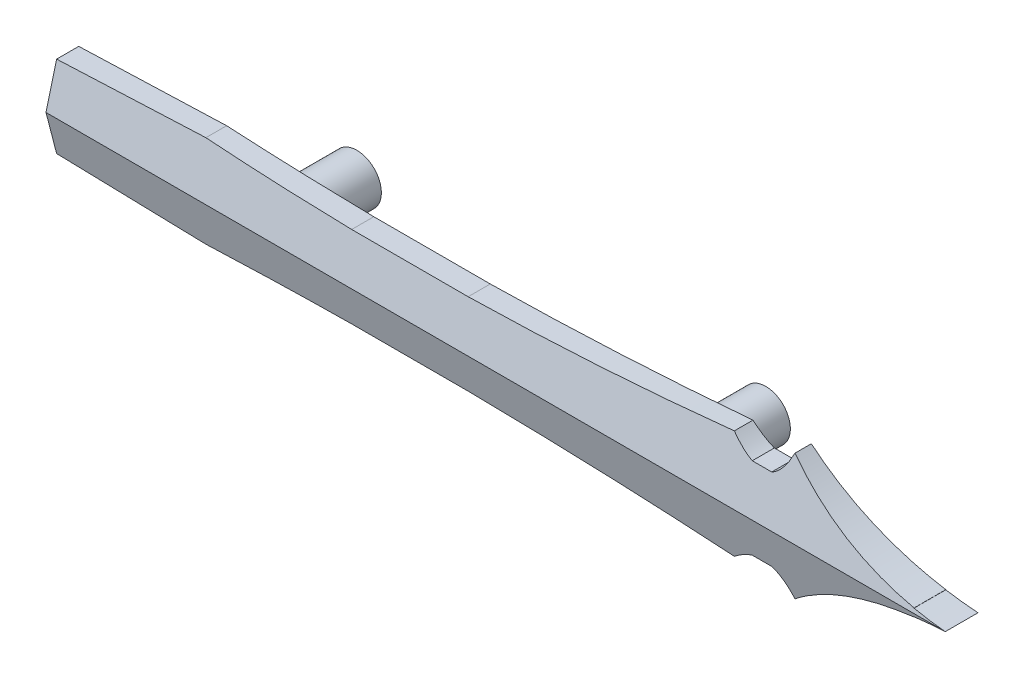
ISO-10303-21;
HEADER;
FILE_DESCRIPTION(('STEP AP214'),'2;1');
FILE_NAME('part.step','',(''),(''),'','','');
FILE_SCHEMA(('AUTOMOTIVE_DESIGN { 1 0 10303 214 1 1 1 1 }'));
ENDSEC;
DATA;
#1=APPLICATION_CONTEXT('core data for automotive mechanical design processes');
#2=APPLICATION_PROTOCOL_DEFINITION('international standard','automotive_design',2000,#1);
#3=PRODUCT_CONTEXT('',#1,'mechanical');
#4=PRODUCT('Part','Part','',(#3));
#5=PRODUCT_RELATED_PRODUCT_CATEGORY('part','',(#4));
#6=PRODUCT_DEFINITION_FORMATION('','',#4);
#7=PRODUCT_DEFINITION_CONTEXT('part definition',#1,'design');
#8=PRODUCT_DEFINITION('design','',#6,#7);
#9=PRODUCT_DEFINITION_SHAPE('','',#8);
#10=(LENGTH_UNIT() NAMED_UNIT(*) SI_UNIT(.MILLI.,.METRE.));
#11=(NAMED_UNIT(*) PLANE_ANGLE_UNIT() SI_UNIT($,.RADIAN.));
#12=(NAMED_UNIT(*) SI_UNIT($,.STERADIAN.) SOLID_ANGLE_UNIT());
#13=UNCERTAINTY_MEASURE_WITH_UNIT(LENGTH_MEASURE(1.E-05),#10,'distance_accuracy_value','');
#14=(GEOMETRIC_REPRESENTATION_CONTEXT(3) GLOBAL_UNCERTAINTY_ASSIGNED_CONTEXT((#13)) GLOBAL_UNIT_ASSIGNED_CONTEXT((#10,
#11,#12)) REPRESENTATION_CONTEXT('',''));
#15=CARTESIAN_POINT('',(0.,0.,0.));
#16=DIRECTION('',(0.,0.,1.));
#17=DIRECTION('',(1.,0.,0.));
#18=AXIS2_PLACEMENT_3D('',#15,#16,#17);
#19=CARTESIAN_POINT('',(0.,0.,2.));
#20=DIRECTION('',(0.,1.,0.));
#21=DIRECTION('',(0.,0.,1.));
#22=AXIS2_PLACEMENT_3D('',#19,#20,#21);
#23=PLANE('',#22);
#24=DIRECTION('',(0.,0.,1.));
#25=VECTOR('',#24,1.);
#26=CARTESIAN_POINT('',(43.7125403808732,0.,0.));
#27=LINE('',#26,#25);
#28=CARTESIAN_POINT('',(43.7125403813381,-2.16670404491401E-10,0.));
#29=VERTEX_POINT('',#28);
#30=CARTESIAN_POINT('',(43.712540373723,3.33268501228993E-09,1.35167559611729));
#31=VERTEX_POINT('',#30);
#32=EDGE_CURVE('E417',#29,#31,#27,.T.);
#33=ORIENTED_EDGE('',*,*,#32,.T.);
#34=DIRECTION('',(-1.,0.,0.));
#35=VECTOR('',#34,1.);
#36=CARTESIAN_POINT('',(0.,0.,1.35167559525303));
#37=LINE('',#36,#35);
#38=CARTESIAN_POINT('',(42.5233075347022,0.,1.35167559525303));
#39=VERTEX_POINT('',#38);
#40=EDGE_CURVE('E513',#31,#39,#37,.T.);
#41=ORIENTED_EDGE('',*,*,#40,.T.);
#42=DIRECTION('',(0.,0.,1.));
#43=VECTOR('',#42,1.);
#44=CARTESIAN_POINT('',(42.5233075339642,1.46421503394167E-13,0.));
#45=LINE('',#44,#43);
#46=CARTESIAN_POINT('',(42.5233075347022,2.68764421525527E-10,0.));
#47=VERTEX_POINT('',#46);
#48=EDGE_CURVE('E425',#39,#47,#45,.F.);
#49=ORIENTED_EDGE('',*,*,#48,.T.);
#50=DIRECTION('',(1.,0.,0.));
#51=VECTOR('',#50,1.);
#52=CARTESIAN_POINT('',(0.,0.,0.));
#53=LINE('',#52,#51);
#54=EDGE_CURVE('E451',#47,#29,#53,.T.);
#55=ORIENTED_EDGE('',*,*,#54,.T.);
#56=EDGE_LOOP('',(#33,#41,#49,#55));
#57=FACE_BOUND('',#56,.T.);
#58=ADVANCED_FACE('F39',(#57),#23,.F.);
#59=CARTESIAN_POINT('',(53.,0.,2.));
#60=DIRECTION('',(-1.,0.,0.));
#61=DIRECTION('',(0.,0.,1.));
#62=AXIS2_PLACEMENT_3D('',#59,#60,#61);
#63=PLANE('',#62);
#64=DIRECTION('',(0.,0.,1.));
#65=VECTOR('',#64,1.);
#66=CARTESIAN_POINT('',(53.,2.26959812022795,0.));
#67=LINE('',#66,#65);
#68=CARTESIAN_POINT('',(53.0000000097392,2.26959812185272,0.));
#69=VERTEX_POINT('',#68);
#70=CARTESIAN_POINT('',(53.,2.26959812185272,1.94024993579903));
#71=VERTEX_POINT('',#70);
#72=EDGE_CURVE('E428',#69,#71,#67,.T.);
#73=ORIENTED_EDGE('',*,*,#72,.T.);
#74=DIRECTION('',(0.,-0.967980317214736,-0.251026105186011));
#75=VECTOR('',#74,1.);
#76=CARTESIAN_POINT('',(53.,0.157535263712145,1.39252917768216));
#77=LINE('',#76,#75);
#78=CARTESIAN_POINT('',(52.9999999998543,2.25995721999383,1.93774976301548));
#79=VERTEX_POINT('',#78);
#80=EDGE_CURVE('E516',#71,#79,#77,.T.);
#81=ORIENTED_EDGE('',*,*,#80,.T.);
#82=DIRECTION('',(0.,0.,1.));
#83=VECTOR('',#82,1.);
#84=CARTESIAN_POINT('',(53.,2.25995722001803,0.));
#85=LINE('',#84,#83);
#86=CARTESIAN_POINT('',(52.9999999998625,2.25995721999518,0.));
#87=VERTEX_POINT('',#86);
#88=EDGE_CURVE('E478',#79,#87,#85,.F.);
#89=ORIENTED_EDGE('',*,*,#88,.T.);
#90=DIRECTION('',(0.,1.,0.));
#91=VECTOR('',#90,1.);
#92=CARTESIAN_POINT('',(53.,0.,0.));
#93=LINE('',#92,#91);
#94=EDGE_CURVE('E455',#87,#69,#93,.T.);
#95=ORIENTED_EDGE('',*,*,#94,.T.);
#96=EDGE_LOOP('',(#73,#81,#89,#95));
#97=FACE_BOUND('',#96,.T.);
#98=ADVANCED_FACE('F382',(#97),#63,.F.);
#99=CARTESIAN_POINT('',(0.,5.,2.));
#100=DIRECTION('',(0.,-1.,0.));
#101=DIRECTION('',(0.,0.,-1.));
#102=AXIS2_PLACEMENT_3D('',#99,#100,#101);
#103=PLANE('',#102);
#104=DIRECTION('',(0.,0.,1.));
#105=VECTOR('',#104,1.);
#106=CARTESIAN_POINT('',(18.0374853520465,5.,0.));
#107=LINE('',#106,#105);
#108=CARTESIAN_POINT('',(18.0374853826043,4.9999999995201,0.));
#109=VERTEX_POINT('',#108);
#110=CARTESIAN_POINT('',(18.0374853826043,5.,1.35167559525303));
#111=VERTEX_POINT('',#110);
#112=EDGE_CURVE('E419',#109,#111,#107,.T.);
#113=ORIENTED_EDGE('',*,*,#112,.T.);
#114=DIRECTION('',(1.,0.,0.));
#115=VECTOR('',#114,1.);
#116=CARTESIAN_POINT('',(0.,5.,1.35167559525303));
#117=LINE('',#116,#115);
#118=CARTESIAN_POINT('',(25.1575867331901,4.99999999999985,1.35167559525307));
#119=VERTEX_POINT('',#118);
#120=EDGE_CURVE('E271',#111,#119,#117,.T.);
#121=ORIENTED_EDGE('',*,*,#120,.T.);
#122=DIRECTION('',(0.,0.,1.));
#123=VECTOR('',#122,1.);
#124=CARTESIAN_POINT('',(25.1575867331995,5.,0.));
#125=LINE('',#124,#123);
#126=CARTESIAN_POINT('',(25.1575867331998,5.,0.));
#127=VERTEX_POINT('',#126);
#128=EDGE_CURVE('E413',#119,#127,#125,.F.);
#129=ORIENTED_EDGE('',*,*,#128,.T.);
#130=DIRECTION('',(-1.,0.,0.));
#131=VECTOR('',#130,1.);
#132=CARTESIAN_POINT('',(0.,5.,0.));
#133=LINE('',#132,#131);
#134=EDGE_CURVE('E458',#127,#109,#133,.T.);
#135=ORIENTED_EDGE('',*,*,#134,.T.);
#136=EDGE_LOOP('',(#113,#121,#129,#135));
#137=FACE_BOUND('',#136,.T.);
#138=ADVANCED_FACE('F388',(#137),#103,.F.);
#139=DIRECTION('',(0.,0.,1.));
#140=VECTOR('',#139,1.);
#141=CARTESIAN_POINT('',(42.5233075339653,4.99999999999946,0.));
#142=LINE('',#141,#140);
#143=CARTESIAN_POINT('',(42.5233075347023,4.99999999973124,0.));
#144=VERTEX_POINT('',#143);
#145=CARTESIAN_POINT('',(42.5233075347023,5.,1.35167559525303));
#146=VERTEX_POINT('',#145);
#147=EDGE_CURVE('E585',#144,#146,#142,.T.);
#148=ORIENTED_EDGE('',*,*,#147,.T.);
#149=DIRECTION('',(1.,0.,0.));
#150=VECTOR('',#149,1.);
#151=CARTESIAN_POINT('',(0.,5.,1.35167559525303));
#152=LINE('',#151,#150);
#153=CARTESIAN_POINT('',(43.71254037364,4.99999999662865,1.35167559612732));
#154=VERTEX_POINT('',#153);
#155=EDGE_CURVE('E587',#146,#154,#152,.T.);
#156=ORIENTED_EDGE('',*,*,#155,.T.);
#157=DIRECTION('',(0.,0.,1.));
#158=VECTOR('',#157,1.);
#159=CARTESIAN_POINT('',(43.7125403808732,5.,0.));
#160=LINE('',#159,#158);
#161=CARTESIAN_POINT('',(43.712540381338,5.00000000021667,0.));
#162=VERTEX_POINT('',#161);
#163=EDGE_CURVE('E586',#154,#162,#160,.F.);
#164=ORIENTED_EDGE('',*,*,#163,.T.);
#165=EDGE_CURVE('E463',#162,#144,#133,.T.);
#166=ORIENTED_EDGE('',*,*,#165,.T.);
#167=EDGE_LOOP('',(#148,#156,#164,#166));
#168=FACE_BOUND('',#167,.T.);
#169=ADVANCED_FACE('F400',(#168),#103,.F.);
#170=CARTESIAN_POINT('',(0.,0.,2.));
#171=DIRECTION('',(1.,0.,0.));
#172=DIRECTION('',(0.,0.,-1.));
#173=AXIS2_PLACEMENT_3D('',#170,#171,#172);
#174=PLANE('',#173);
#175=DIRECTION('',(0.,0.,-1.));
#176=VECTOR('',#175,1.);
#177=CARTESIAN_POINT('',(0.,0.,2.));
#178=LINE('',#177,#176);
#179=CARTESIAN_POINT('',(0.,0.,1.35167559525303));
#180=VERTEX_POINT('',#179);
#181=CARTESIAN_POINT('',(0.,0.,0.));
#182=VERTEX_POINT('',#181);
#183=EDGE_CURVE('E215',#180,#182,#178,.T.);
#184=ORIENTED_EDGE('',*,*,#183,.F.);
#185=DIRECTION('',(0.,-0.967980317214736,-0.251026105186011));
#186=VECTOR('',#185,1.);
#187=CARTESIAN_POINT('',(0.,2.5,2.));
#188=LINE('',#187,#186);
#189=CARTESIAN_POINT('',(0.,2.5,2.));
#190=VERTEX_POINT('',#189);
#191=EDGE_CURVE('E196',#190,#180,#188,.T.);
#192=ORIENTED_EDGE('',*,*,#191,.F.);
#193=DIRECTION('',(0.,-0.967980317214737,0.25102610518601));
#194=VECTOR('',#193,1.);
#195=CARTESIAN_POINT('',(0.,6.35609423568702,1.));
#196=LINE('',#195,#194);
#197=CARTESIAN_POINT('',(0.,5.,1.35167559525303));
#198=VERTEX_POINT('',#197);
#199=EDGE_CURVE('E205',#198,#190,#196,.T.);
#200=ORIENTED_EDGE('',*,*,#199,.F.);
#201=DIRECTION('',(0.,0.,-1.));
#202=VECTOR('',#201,1.);
#203=CARTESIAN_POINT('',(0.,5.,2.));
#204=LINE('',#203,#202);
#205=CARTESIAN_POINT('',(0.,5.,0.));
#206=VERTEX_POINT('',#205);
#207=EDGE_CURVE('E464',#198,#206,#204,.T.);
#208=ORIENTED_EDGE('',*,*,#207,.T.);
#209=DIRECTION('',(0.,-1.,0.));
#210=VECTOR('',#209,1.);
#211=CARTESIAN_POINT('',(0.,0.,0.));
#212=LINE('',#211,#210);
#213=EDGE_CURVE('E445',#206,#182,#212,.T.);
#214=ORIENTED_EDGE('',*,*,#213,.T.);
#215=EDGE_LOOP('',(#184,#192,#200,#208,#214));
#216=FACE_BOUND('',#215,.T.);
#217=ADVANCED_FACE('F41',(#216),#174,.F.);
#218=DIRECTION('',(0.,0.,1.));
#219=VECTOR('',#218,1.);
#220=CARTESIAN_POINT('',(25.1575867331998,0.,0.));
#221=LINE('',#220,#219);
#222=CARTESIAN_POINT('',(25.1575867332002,0.,0.));
#223=VERTEX_POINT('',#222);
#224=CARTESIAN_POINT('',(25.1575867331905,1.48644117847763E-13,1.35167559525307));
#225=VERTEX_POINT('',#224);
#226=EDGE_CURVE('E404',#223,#225,#221,.T.);
#227=ORIENTED_EDGE('',*,*,#226,.T.);
#228=DIRECTION('',(-1.,0.,0.));
#229=VECTOR('',#228,1.);
#230=CARTESIAN_POINT('',(0.,0.,1.35167559525303));
#231=LINE('',#230,#229);
#232=CARTESIAN_POINT('',(18.0374853826039,0.,1.35167559525303));
#233=VERTEX_POINT('',#232);
#234=EDGE_CURVE('E353',#225,#233,#231,.T.);
#235=ORIENTED_EDGE('',*,*,#234,.T.);
#236=DIRECTION('',(0.,0.,1.));
#237=VECTOR('',#236,1.);
#238=CARTESIAN_POINT('',(18.0374853520461,0.,0.));
#239=LINE('',#238,#237);
#240=CARTESIAN_POINT('',(18.0374853826039,4.79898896500481E-10,0.));
#241=VERTEX_POINT('',#240);
#242=EDGE_CURVE('E412',#233,#241,#239,.F.);
#243=ORIENTED_EDGE('',*,*,#242,.T.);
#244=EDGE_CURVE('E407',#241,#223,#53,.T.);
#245=ORIENTED_EDGE('',*,*,#244,.T.);
#246=EDGE_LOOP('',(#227,#235,#243,#245));
#247=FACE_BOUND('',#246,.T.);
#248=ADVANCED_FACE('F384',(#247),#23,.F.);
#249=DIRECTION('',(0.,0.,1.));
#250=VECTOR('',#249,1.);
#251=CARTESIAN_POINT('',(53.,2.74004277998198,0.));
#252=LINE('',#251,#250);
#253=CARTESIAN_POINT('',(52.9999999998624,2.74004278000483,0.));
#254=VERTEX_POINT('',#253);
#255=CARTESIAN_POINT('',(53.,2.74004277998198,1.93774976302175));
#256=VERTEX_POINT('',#255);
#257=EDGE_CURVE('E471',#254,#256,#252,.T.);
#258=ORIENTED_EDGE('',*,*,#257,.T.);
#259=DIRECTION('',(0.,-0.967980317214737,0.25102610518601));
#260=VECTOR('',#259,1.);
#261=CARTESIAN_POINT('',(53.,0.157535263712144,2.60747082231783));
#262=LINE('',#261,#260);
#263=CARTESIAN_POINT('',(53.,2.73040187814729,1.94024993579903));
#264=VERTEX_POINT('',#263);
#265=EDGE_CURVE('E61',#256,#264,#262,.T.);
#266=ORIENTED_EDGE('',*,*,#265,.T.);
#267=DIRECTION('',(0.,0.,1.));
#268=VECTOR('',#267,1.);
#269=CARTESIAN_POINT('',(53.,2.73040187977207,0.));
#270=LINE('',#269,#268);
#271=CARTESIAN_POINT('',(53.0000000097392,2.73040187814729,0.));
#272=VERTEX_POINT('',#271);
#273=EDGE_CURVE('E68',#264,#272,#270,.F.);
#274=ORIENTED_EDGE('',*,*,#273,.T.);
#275=EDGE_CURVE('E459',#272,#254,#93,.T.);
#276=ORIENTED_EDGE('',*,*,#275,.T.);
#277=EDGE_LOOP('',(#258,#266,#274,#276));
#278=FACE_BOUND('',#277,.T.);
#279=ADVANCED_FACE('F391',(#278),#63,.F.);
#280=CARTESIAN_POINT('',(0.,0.,0.));
#281=DIRECTION('',(0.,0.,-1.));
#282=DIRECTION('',(-1.,0.,0.));
#283=AXIS2_PLACEMENT_3D('',#280,#281,#282);
#284=PLANE('',#283);
#285=CARTESIAN_POINT('',(44.782995011625,6.35609423568702,0.));
#286=CARTESIAN_POINT('',(48.8099650843284,2.99269146796821,0.));
#287=CARTESIAN_POINT('',(54.9707537201559,2.50000000000001,0.));
#288=B_SPLINE_CURVE_WITH_KNOTS('',2,(#285,#286,#287),.UNSPECIFIED.,.F.,.F.,(3,3),(0.,1.),.UNSPECIFIED.);
#289=CARTESIAN_POINT('',(44.782995011625,6.35609423568702,0.));
#290=VERTEX_POINT('',#289);
#291=EDGE_CURVE('E356',#290,#254,#288,.T.);
#292=ORIENTED_EDGE('',*,*,#291,.T.);
#293=ORIENTED_EDGE('',*,*,#275,.F.);
#294=CARTESIAN_POINT('',(54.9707537201559,2.50000000000001,0.));
#295=CARTESIAN_POINT('',(49.1405805992995,2.90328076339253,0.));
#296=CARTESIAN_POINT('',(44.782995011625,6.35609423568702,0.));
#297=B_SPLINE_CURVE_WITH_KNOTS('',2,(#294,#295,#296),.UNSPECIFIED.,.F.,.F.,(3,3),(0.,1.),.UNSPECIFIED.);
#298=CARTESIAN_POINT('',(54.9707537201559,2.50000000000001,0.));
#299=VERTEX_POINT('',#298);
#300=EDGE_CURVE('E482',#299,#272,#297,.T.);
#301=ORIENTED_EDGE('',*,*,#300,.F.);
#302=CARTESIAN_POINT('',(44.782995011625,-1.35609423568701,0.));
#303=CARTESIAN_POINT('',(49.1405805992995,2.09671923660748,0.));
#304=CARTESIAN_POINT('',(54.9707537201559,2.50000000000001,0.));
#305=B_SPLINE_CURVE_WITH_KNOTS('',2,(#302,#303,#304),.UNSPECIFIED.,.F.,.F.,(3,3),(0.,1.),.UNSPECIFIED.);
#306=EDGE_CURVE('E477',#69,#299,#305,.T.);
#307=ORIENTED_EDGE('',*,*,#306,.F.);
#308=ORIENTED_EDGE('',*,*,#94,.F.);
#309=CARTESIAN_POINT('',(54.9707537201559,2.50000000000001,0.));
#310=CARTESIAN_POINT('',(48.8099650843284,2.0073085320318,0.));
#311=CARTESIAN_POINT('',(44.782995011625,-1.35609423568701,0.));
#312=B_SPLINE_CURVE_WITH_KNOTS('',2,(#309,#310,#311),.UNSPECIFIED.,.F.,.F.,(3,3),(0.,1.),.UNSPECIFIED.);
#313=CARTESIAN_POINT('',(44.782995011625,-1.356094235687,0.));
#314=VERTEX_POINT('',#313);
#315=EDGE_CURVE('E362',#87,#314,#312,.T.);
#316=ORIENTED_EDGE('',*,*,#315,.T.);
#317=CARTESIAN_POINT('',(41.2148129091188,-0.820866920311075,0.));
#318=CARTESIAN_POINT('',(43.7186934270373,1.30154871186977,0.));
#319=CARTESIAN_POINT('',(44.782995011625,-1.35609423568701,0.));
#320=B_SPLINE_CURVE_WITH_KNOTS('',2,(#317,#318,#319),.UNSPECIFIED.,.F.,.F.,(3,3),(0.,1.),.UNSPECIFIED.);
#321=EDGE_CURVE('E315',#29,#314,#320,.T.);
#322=ORIENTED_EDGE('',*,*,#321,.F.);
#323=ORIENTED_EDGE('',*,*,#54,.F.);
#324=CARTESIAN_POINT('',(41.2148129091188,-0.820866920311075,0.));
#325=VERTEX_POINT('',#324);
#326=EDGE_CURVE('E316',#325,#47,#320,.T.);
#327=ORIENTED_EDGE('',*,*,#326,.F.);
#328=CARTESIAN_POINT('',(9.04165224886548,-0.319771496859429,0.));
#329=CARTESIAN_POINT('',(25.1281585749519,0.571238550950233,0.));
#330=CARTESIAN_POINT('',(41.2148129091188,-0.820866920311075,0.));
#331=B_SPLINE_CURVE_WITH_KNOTS('',2,(#328,#329,#330),.UNSPECIFIED.,.F.,.F.,(3,3),(0.,1.),.UNSPECIFIED.);
#332=EDGE_CURVE('E307',#223,#325,#331,.T.);
#333=ORIENTED_EDGE('',*,*,#332,.F.);
#334=ORIENTED_EDGE('',*,*,#244,.F.);
#335=CARTESIAN_POINT('',(9.04165224886548,-0.319771496859429,0.));
#336=VERTEX_POINT('',#335);
#337=EDGE_CURVE('E308',#336,#241,#331,.T.);
#338=ORIENTED_EDGE('',*,*,#337,.F.);
#339=DIRECTION('',(0.999375191786026,-0.0353443919546558,0.));
#340=VECTOR('',#339,1.);
#341=CARTESIAN_POINT('',(9.04165224886548,-0.319771496859429,0.));
#342=LINE('',#341,#340);
#343=EDGE_CURVE('E303',#182,#336,#342,.T.);
#344=ORIENTED_EDGE('',*,*,#343,.F.);
#345=ORIENTED_EDGE('',*,*,#213,.F.);
#346=DIRECTION('',(-0.999375191786026,-0.0353443919546558,0.));
#347=VECTOR('',#346,1.);
#348=CARTESIAN_POINT('',(9.04165224886548,5.31977149685943,0.));
#349=LINE('',#348,#347);
#350=CARTESIAN_POINT('',(9.04165224886548,5.31977149685943,0.));
#351=VERTEX_POINT('',#350);
#352=EDGE_CURVE('E290',#351,#206,#349,.T.);
#353=ORIENTED_EDGE('',*,*,#352,.F.);
#354=CARTESIAN_POINT('',(41.2148129091188,5.82086692031108,0.));
#355=CARTESIAN_POINT('',(25.1281585749519,4.42876144904978,0.));
#356=CARTESIAN_POINT('',(9.04165224886548,5.31977149685943,0.));
#357=B_SPLINE_CURVE_WITH_KNOTS('',2,(#354,#355,#356),.UNSPECIFIED.,.F.,.F.,(3,3),(0.,1.),.UNSPECIFIED.);
#358=EDGE_CURVE('E291',#109,#351,#357,.T.);
#359=ORIENTED_EDGE('',*,*,#358,.F.);
#360=ORIENTED_EDGE('',*,*,#134,.F.);
#361=CARTESIAN_POINT('',(41.2148129091188,5.82086692031108,0.));
#362=VERTEX_POINT('',#361);
#363=EDGE_CURVE('E283',#362,#127,#357,.T.);
#364=ORIENTED_EDGE('',*,*,#363,.F.);
#365=CARTESIAN_POINT('',(44.782995011625,6.35609423568702,0.));
#366=CARTESIAN_POINT('',(43.7186934270373,3.69845128813024,0.));
#367=CARTESIAN_POINT('',(41.2148129091188,5.82086692031108,0.));
#368=B_SPLINE_CURVE_WITH_KNOTS('',2,(#365,#366,#367),.UNSPECIFIED.,.F.,.F.,(3,3),(0.,1.),.UNSPECIFIED.);
#369=EDGE_CURVE('E564',#144,#362,#368,.T.);
#370=ORIENTED_EDGE('',*,*,#369,.F.);
#371=ORIENTED_EDGE('',*,*,#165,.F.);
#372=EDGE_CURVE('E292',#290,#162,#368,.T.);
#373=ORIENTED_EDGE('',*,*,#372,.F.);
#374=EDGE_LOOP('',(#292,#293,#301,#307,#308,#316,#322,#323,#327,#333,#334,#338,#344,#345,#353,
#359,#360,#364,#370,#371,#373));
#375=FACE_BOUND('',#374,.T.);
#376=CARTESIAN_POINT('',(13.,2.5,0.));
#377=DIRECTION('',(0.,0.,-1.));
#378=DIRECTION('',(-1.,0.,0.));
#379=AXIS2_PLACEMENT_3D('',#376,#377,#378);
#380=CIRCLE('',#379,1.5);
#381=CARTESIAN_POINT('',(11.5,2.5,0.));
#382=VERTEX_POINT('',#381);
#383=EDGE_CURVE('E432',#382,#382,#380,.T.);
#384=ORIENTED_EDGE('',*,*,#383,.F.);
#385=EDGE_LOOP('',(#384));
#386=FACE_BOUND('',#385,.T.);
#387=CARTESIAN_POINT('',(38.,2.5,0.));
#388=DIRECTION('',(0.,0.,-1.));
#389=DIRECTION('',(-1.,0.,0.));
#390=AXIS2_PLACEMENT_3D('',#387,#388,#389);
#391=CIRCLE('',#390,1.5);
#392=CARTESIAN_POINT('',(36.5,2.5,0.));
#393=VERTEX_POINT('',#392);
#394=EDGE_CURVE('E437',#393,#393,#391,.T.);
#395=ORIENTED_EDGE('',*,*,#394,.F.);
#396=EDGE_LOOP('',(#395));
#397=FACE_BOUND('',#396,.T.);
#398=ADVANCED_FACE('F399',(#375,#386,#397),#284,.T.);
#399=CARTESIAN_POINT('',(38.,2.5,-4.));
#400=DIRECTION('',(0.,0.,1.));
#401=DIRECTION('',(1.,0.,0.));
#402=AXIS2_PLACEMENT_3D('',#399,#400,#401);
#403=CYLINDRICAL_SURFACE('',#402,1.5);
#404=CARTESIAN_POINT('',(38.,2.5,-4.));
#405=DIRECTION('',(0.,0.,-1.));
#406=DIRECTION('',(-1.,0.,0.));
#407=AXIS2_PLACEMENT_3D('',#404,#405,#406);
#408=CIRCLE('',#407,1.5);
#409=CARTESIAN_POINT('',(36.5,2.5,-4.));
#410=VERTEX_POINT('',#409);
#411=EDGE_CURVE('E441',#410,#410,#408,.T.);
#412=ORIENTED_EDGE('',*,*,#411,.F.);
#413=EDGE_LOOP('',(#412));
#414=FACE_BOUND('',#413,.T.);
#415=ORIENTED_EDGE('',*,*,#394,.T.);
#416=EDGE_LOOP('',(#415));
#417=FACE_BOUND('',#416,.T.);
#418=ADVANCED_FACE('F742',(#414,#417),#403,.T.);
#419=CARTESIAN_POINT('',(38.,2.5,-4.));
#420=DIRECTION('',(0.,0.,-1.));
#421=DIRECTION('',(-1.,0.,0.));
#422=AXIS2_PLACEMENT_3D('',#419,#420,#421);
#423=PLANE('',#422);
#424=ORIENTED_EDGE('',*,*,#411,.T.);
#425=EDGE_LOOP('',(#424));
#426=FACE_BOUND('',#425,.T.);
#427=ADVANCED_FACE('F785',(#426),#423,.T.);
#428=CARTESIAN_POINT('',(13.,2.5,-4.));
#429=DIRECTION('',(0.,0.,1.));
#430=DIRECTION('',(1.,0.,0.));
#431=AXIS2_PLACEMENT_3D('',#428,#429,#430);
#432=CYLINDRICAL_SURFACE('',#431,1.5);
#433=CARTESIAN_POINT('',(13.,2.5,-4.));
#434=DIRECTION('',(0.,0.,-1.));
#435=DIRECTION('',(-1.,0.,0.));
#436=AXIS2_PLACEMENT_3D('',#433,#434,#435);
#437=CIRCLE('',#436,1.5);
#438=CARTESIAN_POINT('',(11.5,2.5,-4.));
#439=VERTEX_POINT('',#438);
#440=EDGE_CURVE('E433',#439,#439,#437,.T.);
#441=ORIENTED_EDGE('',*,*,#440,.F.);
#442=EDGE_LOOP('',(#441));
#443=FACE_BOUND('',#442,.T.);
#444=ORIENTED_EDGE('',*,*,#383,.T.);
#445=EDGE_LOOP('',(#444));
#446=FACE_BOUND('',#445,.T.);
#447=ADVANCED_FACE('F777',(#443,#446),#432,.T.);
#448=CARTESIAN_POINT('',(13.,2.5,-4.));
#449=DIRECTION('',(0.,0.,-1.));
#450=DIRECTION('',(-1.,0.,0.));
#451=AXIS2_PLACEMENT_3D('',#448,#449,#450);
#452=PLANE('',#451);
#453=ORIENTED_EDGE('',*,*,#440,.T.);
#454=EDGE_LOOP('',(#453));
#455=FACE_BOUND('',#454,.T.);
#456=ADVANCED_FACE('F501',(#455),#452,.T.);
#457=DIRECTION('',(0.,0.,1.));
#458=VECTOR('',#457,1.);
#459=SURFACE_OF_LINEAR_EXTRUSION('',#368,#458);
#460=CARTESIAN_POINT('',(44.782995011625,6.35609423568702,1.));
#461=CARTESIAN_POINT('',(44.7527030860267,6.28055849577322,1.01958866544668));
#462=CARTESIAN_POINT('',(44.7206948112629,6.20561304852778,1.03902425043624));
#463=CARTESIAN_POINT('',(44.6523530186859,6.05722769973505,1.07750498760795));
#464=CARTESIAN_POINT('',(44.6160020214942,5.98379537937667,1.09654817376217));
#465=CARTESIAN_POINT('',(44.5371081132479,5.83714497668158,1.13457898777541));
#466=CARTESIAN_POINT('',(44.4944071653343,5.76400534781245,1.15354627031536));
#467=CARTESIAN_POINT('',(44.4027247959692,5.62163935147863,1.19046601024723));
#468=CARTESIAN_POINT('',(44.3537546739796,5.55240625870536,1.20842021171183));
#469=CARTESIAN_POINT('',(44.2435148682552,5.41340493057235,1.24446739304019));
#470=CARTESIAN_POINT('',(44.1815330023051,5.34415582327035,1.26242574754832));
#471=CARTESIAN_POINT('',(44.0478150734192,5.21624989139179,1.29559556240769));
#472=CARTESIAN_POINT('',(43.9761926770177,5.15748585336948,1.31083482639629));
#473=CARTESIAN_POINT('',(43.8698793715246,5.08599530273705,1.32937445386982));
#474=CARTESIAN_POINT('',(43.8395161548936,5.06715671851929,1.33425985942952));
#475=CARTESIAN_POINT('',(43.7771833571442,5.03176245367287,1.34343864570472));
#476=CARTESIAN_POINT('',(43.7452059896785,5.01521964494304,1.34772868835376));
#477=CARTESIAN_POINT('',(43.71254037364,4.99999999662865,1.35167559612732));
#478=B_SPLINE_CURVE_WITH_KNOTS('',3,(#460,#461,#462,#463,#464,#465,#466,#467,#468,#469,#470,
#471,#472,#473,#474,#475,#476,#477),.UNSPECIFIED.,.F.,.F.,(4,2,2,2,2,2,2,2,4),(0.,
0.251181340584667,0.503410089021979,0.763523467934452,1.02317445462084,1.30633515398253,
1.58640986778179,1.6945062541546,1.80318613869037),.UNSPECIFIED.);
#479=CARTESIAN_POINT('',(44.782995011625,6.35609423568702,1.));
#480=VERTEX_POINT('',#479);
#481=EDGE_CURVE('E202',#480,#154,#478,.T.);
#482=ORIENTED_EDGE('',*,*,#481,.F.);
#483=DIRECTION('',(0.,0.,1.));
#484=VECTOR('',#483,1.);
#485=CARTESIAN_POINT('',(44.782995011625,6.35609423568702,0.));
#486=LINE('',#485,#484);
#487=EDGE_CURVE('E473',#290,#480,#486,.T.);
#488=ORIENTED_EDGE('',*,*,#487,.F.);
#489=ORIENTED_EDGE('',*,*,#372,.T.);
#490=ORIENTED_EDGE('',*,*,#163,.F.);
#491=EDGE_LOOP('',(#482,#488,#489,#490));
#492=FACE_BOUND('',#491,.T.);
#493=ADVANCED_FACE('F228',(#492),#459,.T.);
#494=CARTESIAN_POINT('',(42.5233075757519,4.99999998479221,1.35167559919687));
#495=CARTESIAN_POINT('',(42.4665051121251,5.02069384076773,1.34630906645397));
#496=CARTESIAN_POINT('',(42.4105281375681,5.04339151388736,1.34042288428819));
#497=CARTESIAN_POINT('',(42.3003278695169,5.09211106479002,1.32778845475279));
#498=CARTESIAN_POINT('',(42.246099988029,5.1181231765259,1.32104274000984));
#499=CARTESIAN_POINT('',(42.1392052649388,5.17289845490063,1.30683788011098));
#500=CARTESIAN_POINT('',(42.0865375276851,5.20166000141058,1.29937915510272));
#501=CARTESIAN_POINT('',(41.9830743028308,5.26124218159653,1.28392772250169));
#502=CARTESIAN_POINT('',(41.932266663404,5.29204312266619,1.27594012178783));
#503=CARTESIAN_POINT('',(41.8319224628895,5.35558325236537,1.25946227508192));
#504=CARTESIAN_POINT('',(41.7823867085035,5.38832362959046,1.25097172085166));
#505=CARTESIAN_POINT('',(41.6845154211033,5.45544449875947,1.23356528183163));
#506=CARTESIAN_POINT('',(41.6361799550861,5.48982508194381,1.2246493733805));
#507=CARTESIAN_POINT('',(41.5244064326647,5.57189024987875,1.20336743291976));
#508=CARTESIAN_POINT('',(41.4614061495338,5.62013225923309,1.19085684412037));
#509=CARTESIAN_POINT('',(41.3369384063158,5.71891614377833,1.1652392428618));
#510=CARTESIAN_POINT('',(41.2754780113977,5.76946637676261,1.15213006297805));
#511=CARTESIAN_POINT('',(41.2148129091188,5.82086692031108,1.13880037225817));
#512=B_SPLINE_CURVE_WITH_KNOTS('',3,(#494,#495,#496,#497,#498,#499,#500,#501,#502,#503,#504,
#505,#506,#507,#508,#509,#510,#511),.UNSPECIFIED.,.F.,.F.,(4,2,2,2,2,2,2,2,4),(0.,
0.181973273376821,0.363422249141292,0.544764955932903,0.724558258228391,0.904462911438941,
1.08437758397792,1.32531174113859,1.5672008565241),.UNSPECIFIED.);
#513=CARTESIAN_POINT('',(41.2148129091188,5.82086692031108,1.13880037225817));
#514=VERTEX_POINT('',#513);
#515=EDGE_CURVE('E258',#146,#514,#512,.T.);
#516=ORIENTED_EDGE('',*,*,#515,.F.);
#517=ORIENTED_EDGE('',*,*,#147,.F.);
#518=ORIENTED_EDGE('',*,*,#369,.T.);
#519=DIRECTION('',(0.,0.,1.));
#520=VECTOR('',#519,1.);
#521=CARTESIAN_POINT('',(41.2148129091188,5.82086692031108,0.));
#522=LINE('',#521,#520);
#523=EDGE_CURVE('E551',#362,#514,#522,.T.);
#524=ORIENTED_EDGE('',*,*,#523,.T.);
#525=EDGE_LOOP('',(#516,#517,#518,#524));
#526=FACE_BOUND('',#525,.T.);
#527=ADVANCED_FACE('F278',(#526),#459,.T.);
#528=DIRECTION('',(0.,0.,1.));
#529=VECTOR('',#528,1.);
#530=SURFACE_OF_LINEAR_EXTRUSION('',#357,#529);
#531=CARTESIAN_POINT('',(41.2148129091188,5.82086692031108,1.13880037225817));
#532=CARTESIAN_POINT('',(40.6806667990345,5.77464289180971,1.15078763856343));
#533=CARTESIAN_POINT('',(40.1463476316382,5.73029204592321,1.16228913286719));
#534=CARTESIAN_POINT('',(39.0775042378003,5.6453544670863,1.18431597496322));
#535=CARTESIAN_POINT('',(38.5429800789241,5.6047669374566,1.19484152935815));
#536=CARTESIAN_POINT('',(37.4737263613696,5.52736029088724,1.21491537658237));
#537=CARTESIAN_POINT('',(36.9389968490646,5.49054057378169,1.22446382505253));
#538=CARTESIAN_POINT('',(35.8693321383081,5.42067365762103,1.24258239578508));
#539=CARTESIAN_POINT('',(35.3343969678768,5.38762605662679,1.25115262228224));
#540=CARTESIAN_POINT('',(34.2643206353634,5.32530754113113,1.26731366806762));
#541=CARTESIAN_POINT('',(33.7291794858471,5.29603642447029,1.27490453978178));
#542=CARTESIAN_POINT('',(32.6586902299351,5.2412750076192,1.28910580497502));
#543=CARTESIAN_POINT('',(32.1233421233358,5.2157847111572,1.29571619748724));
#544=CARTESIAN_POINT('',(31.0524394673707,5.1685891638365,1.3079554075366));
#545=CARTESIAN_POINT('',(30.5168849085763,5.14688411342852,1.3135841730909));
#546=CARTESIAN_POINT('',(29.4455692015636,5.1072632342844,1.32385904624557));
#547=CARTESIAN_POINT('',(28.9098080374369,5.08934780857532,1.32850504932902));
#548=CARTESIAN_POINT('',(27.8380789652014,5.0573104177597,1.33681329826109));
#549=CARTESIAN_POINT('',(27.302111037736,5.04318905933707,1.34047538677852));
#550=CARTESIAN_POINT('',(26.2299682983232,5.01874382944436,1.34681476242616));
#551=CARTESIAN_POINT('',(25.6937934666357,5.00842076922019,1.34949183917616));
#552=CARTESIAN_POINT('',(25.1575867331901,4.99999999999985,1.35167559525307));
#553=B_SPLINE_CURVE_WITH_KNOTS('',3,(#531,#532,#533,#534,#535,#536,#537,#538,#539,#540,#541,
#542,#543,#544,#545,#546,#547,#548,#549,#550,#551,#552),.UNSPECIFIED.,.F.,.F.,(4,2,2,2,2,2,2,2,
2,2,4),(0.,1.60882588569292,3.21731040791804,4.82553831834393,6.43359470320436,8.04156497126647,
9.64953682492184,11.2575938041672,12.8658217145942,14.4743066331419,16.0831348950329),.UNSPECIFIED.);
#554=EDGE_CURVE('E264',#514,#119,#553,.T.);
#555=ORIENTED_EDGE('',*,*,#554,.F.);
#556=ORIENTED_EDGE('',*,*,#523,.F.);
#557=ORIENTED_EDGE('',*,*,#363,.T.);
#558=ORIENTED_EDGE('',*,*,#128,.F.);
#559=EDGE_LOOP('',(#555,#556,#557,#558));
#560=FACE_BOUND('',#559,.T.);
#561=ADVANCED_FACE('F272',(#560),#530,.T.);
#562=CARTESIAN_POINT('',(18.0374853828153,4.99999999951679,1.35167559537834));
#563=CARTESIAN_POINT('',(16.5370527776997,5.02358607953732,1.34555902286249));
#564=CARTESIAN_POINT('',(15.0371837139794,5.06202674432614,1.33559021441558));
#565=CARTESIAN_POINT('',(12.0385726693295,5.16861724344035,1.30794812565962));
#566=CARTESIAN_POINT('',(10.5398306883998,5.23676707776575,1.29027484535057));
#567=CARTESIAN_POINT('',(9.04165224886548,5.31977149685943,1.26874932911046));
#568=B_SPLINE_CURVE_WITH_KNOTS('',3,(#562,#563,#564,#565,#566,#567),.UNSPECIFIED.,.F.,.F.,(4,2,
4),(0.,4.50118411436452,9.00236822872904),.UNSPECIFIED.);
#569=CARTESIAN_POINT('',(9.04165224886548,5.31977149685943,1.26874932911046));
#570=VERTEX_POINT('',#569);
#571=EDGE_CURVE('E534',#111,#570,#568,.T.);
#572=ORIENTED_EDGE('',*,*,#571,.F.);
#573=ORIENTED_EDGE('',*,*,#112,.F.);
#574=ORIENTED_EDGE('',*,*,#358,.T.);
#575=DIRECTION('',(0.,0.,1.));
#576=VECTOR('',#575,1.);
#577=CARTESIAN_POINT('',(9.04165224886548,5.31977149685943,0.));
#578=LINE('',#577,#576);
#579=EDGE_CURVE('E603',#351,#570,#578,.T.);
#580=ORIENTED_EDGE('',*,*,#579,.T.);
#581=EDGE_LOOP('',(#572,#573,#574,#580));
#582=FACE_BOUND('',#581,.T.);
#583=ADVANCED_FACE('F277',(#582),#530,.T.);
#584=CARTESIAN_POINT('',(9.04165224886548,5.31977149685943,0.));
#585=DIRECTION('',(-0.0353443919546558,0.999375191786026,0.));
#586=DIRECTION('',(-0.999375191786026,-0.0353443919546558,0.));
#587=AXIS2_PLACEMENT_3D('',#584,#585,#586);
#588=PLANE('',#587);
#589=DIRECTION('',(-0.99933321424864,-0.0353429073565321,0.00916546774958035));
#590=VECTOR('',#589,1.);
#591=CARTESIAN_POINT('',(9.05327317608491,5.32018248825675,1.26864274680925));
#592=LINE('',#591,#590);
#593=EDGE_CURVE('E208',#570,#198,#592,.T.);
#594=ORIENTED_EDGE('',*,*,#593,.F.);
#595=ORIENTED_EDGE('',*,*,#579,.F.);
#596=ORIENTED_EDGE('',*,*,#352,.T.);
#597=ORIENTED_EDGE('',*,*,#207,.F.);
#598=EDGE_LOOP('',(#594,#595,#596,#597));
#599=FACE_BOUND('',#598,.T.);
#600=ADVANCED_FACE('F280',(#599),#588,.T.);
#601=DIRECTION('',(0.,0.,1.));
#602=VECTOR('',#601,1.);
#603=SURFACE_OF_LINEAR_EXTRUSION('',#297,#602);
#604=CARTESIAN_POINT('',(54.9707537201559,2.50000000000001,2.));
#605=CARTESIAN_POINT('',(54.8606578839791,2.50761531407576,1.99802512241395));
#606=CARTESIAN_POINT('',(54.7506234383484,2.51606953130104,1.99583269227387));
#607=CARTESIAN_POINT('',(54.5307681003425,2.53467797272011,1.99100696959136));
#608=CARTESIAN_POINT('',(54.4209471246713,2.54483127530159,1.98837391605042));
#609=CARTESIAN_POINT('',(54.2015211124928,2.56686517844891,1.98265986919353));
#610=CARTESIAN_POINT('',(54.091916024121,2.57874529444479,1.97957900154098));
#611=CARTESIAN_POINT('',(53.8729226586084,2.60426080944095,1.9729620691123));
#612=CARTESIAN_POINT('',(53.7635343840686,2.61789622937012,1.96942599890868));
#613=CARTESIAN_POINT('',(53.5449808064709,2.64695072320331,1.96189130394083));
#614=CARTESIAN_POINT('',(53.43581557109,2.66237027455026,1.95789255536144));
#615=CARTESIAN_POINT('',(53.2177127172557,2.69502182758626,1.94942503588699));
#616=CARTESIAN_POINT('',(53.1087752590516,2.71225483196028,1.94495600496587));
#617=CARTESIAN_POINT('',(53.0000000002628,2.73040187972823,1.94024993538904));
#618=B_SPLINE_CURVE_WITH_KNOTS('',3,(#604,#605,#606,#607,#608,#609,#610,#611,#612,#613,#614,
#615,#616,#617),.UNSPECIFIED.,.F.,.F.,(4,2,2,2,2,2,4),(0.,0.331127069399107,0.662075108681145,
0.992930457592761,1.32378975173674,1.65473779123668,1.9858697879491),.UNSPECIFIED.);
#619=CARTESIAN_POINT('',(54.9707537201559,2.5,2.));
#620=VERTEX_POINT('',#619);
#621=EDGE_CURVE('E252',#620,#264,#618,.T.);
#622=ORIENTED_EDGE('',*,*,#621,.F.);
#623=DIRECTION('',(0.,0.,1.));
#624=VECTOR('',#623,1.);
#625=CARTESIAN_POINT('',(54.9707537201559,2.50000000000001,0.));
#626=LINE('',#625,#624);
#627=EDGE_CURVE('E576',#299,#620,#626,.T.);
#628=ORIENTED_EDGE('',*,*,#627,.F.);
#629=ORIENTED_EDGE('',*,*,#300,.T.);
#630=ORIENTED_EDGE('',*,*,#273,.F.);
#631=EDGE_LOOP('',(#622,#628,#629,#630));
#632=FACE_BOUND('',#631,.T.);
#633=ADVANCED_FACE('F498',(#632),#603,.T.);
#634=DIRECTION('',(0.,0.,1.));
#635=VECTOR('',#634,1.);
#636=SURFACE_OF_LINEAR_EXTRUSION('',#305,#635);
#637=CARTESIAN_POINT('',(53.0000000097382,2.26959812185256,1.94024993579899));
#638=CARTESIAN_POINT('',(53.1087752680094,2.28774516947951,1.94495600533925));
#639=CARTESIAN_POINT('',(53.2177127256936,2.30497817372169,1.94942503622618));
#640=CARTESIAN_POINT('',(53.4358155784854,2.33762972651221,1.95789255563697));
#641=CARTESIAN_POINT('',(53.5449808133437,2.3530492777455,1.96189130418689));
#642=CARTESIAN_POINT('',(53.7635343898935,2.38210377136914,1.96942599910039));
#643=CARTESIAN_POINT('',(53.872922663908,2.39573919120242,1.97296206927915));
#644=CARTESIAN_POINT('',(54.0919160283675,2.42125470602412,1.97957900166258));
#645=CARTESIAN_POINT('',(54.2015211162114,2.43313482194146,1.98265986929476));
#646=CARTESIAN_POINT('',(54.4209471273316,2.45516872494861,1.98837391611531));
#647=CARTESIAN_POINT('',(54.5307681024724,2.4653220274685,1.99100696964027));
#648=CARTESIAN_POINT('',(54.7506234394149,2.48393046878091,1.99583269229513));
#649=CARTESIAN_POINT('',(54.8606578845126,2.49238468596115,1.99802512242352));
#650=CARTESIAN_POINT('',(54.9707537201559,2.50000000000001,2.));
#651=B_SPLINE_CURVE_WITH_KNOTS('',3,(#637,#638,#639,#640,#641,#642,#643,#644,#645,#646,#647,
#648,#649,#650),.UNSPECIFIED.,.F.,.F.,(4,2,2,2,2,2,4),(0.,0.331131995107631,0.662080033005545,
0.99293932554884,1.32379467285982,1.65474271053985,1.98586977833426),.UNSPECIFIED.);
#652=EDGE_CURVE('E199',#71,#620,#651,.T.);
#653=ORIENTED_EDGE('',*,*,#652,.F.);
#654=ORIENTED_EDGE('',*,*,#72,.F.);
#655=ORIENTED_EDGE('',*,*,#306,.T.);
#656=ORIENTED_EDGE('',*,*,#627,.T.);
#657=EDGE_LOOP('',(#653,#654,#655,#656));
#658=FACE_BOUND('',#657,.T.);
#659=ADVANCED_FACE('F494',(#658),#636,.T.);
#660=CARTESIAN_POINT('',(9.04165224886548,-0.319771496859429,0.));
#661=DIRECTION('',(-0.0353443919546558,-0.999375191786026,0.));
#662=DIRECTION('',(0.999375191786026,-0.0353443919546558,0.));
#663=AXIS2_PLACEMENT_3D('',#660,#661,#662);
#664=PLANE('',#663);
#665=DIRECTION('',(0.99933321424864,-0.0353429073565321,-0.00916546774958038));
#666=VECTOR('',#665,1.);
#667=CARTESIAN_POINT('',(9.05327317608491,-0.32018248825675,1.26864274680925));
#668=LINE('',#667,#666);
#669=CARTESIAN_POINT('',(9.04165224886548,-0.319771496859429,1.26874932911046));
#670=VERTEX_POINT('',#669);
#671=EDGE_CURVE('E352',#180,#670,#668,.T.);
#672=ORIENTED_EDGE('',*,*,#671,.F.);
#673=ORIENTED_EDGE('',*,*,#183,.T.);
#674=ORIENTED_EDGE('',*,*,#343,.T.);
#675=DIRECTION('',(0.,0.,1.));
#676=VECTOR('',#675,1.);
#677=CARTESIAN_POINT('',(9.04165224886548,-0.319771496859429,0.));
#678=LINE('',#677,#676);
#679=EDGE_CURVE('E606',#336,#670,#678,.T.);
#680=ORIENTED_EDGE('',*,*,#679,.T.);
#681=EDGE_LOOP('',(#672,#673,#674,#680));
#682=FACE_BOUND('',#681,.T.);
#683=ADVANCED_FACE('F330',(#682),#664,.T.);
#684=DIRECTION('',(0.,0.,1.));
#685=VECTOR('',#684,1.);
#686=SURFACE_OF_LINEAR_EXTRUSION('',#331,#685);
#687=CARTESIAN_POINT('',(9.04165224886548,-0.319771496859429,1.26874932911046));
#688=CARTESIAN_POINT('',(10.5398306883998,-0.236767077765749,1.29027484535057));
#689=CARTESIAN_POINT('',(12.0385726693294,-0.168617243440355,1.30794812565961));
#690=CARTESIAN_POINT('',(15.0371837139792,-0.0620267443261411,1.33559021441557));
#691=CARTESIAN_POINT('',(16.5370527776994,-0.0235860795373209,1.34555902286249));
#692=CARTESIAN_POINT('',(18.0374853828149,4.83212469061349E-10,1.35167559537834));
#693=B_SPLINE_CURVE_WITH_KNOTS('',3,(#687,#688,#689,#690,#691,#692),.UNSPECIFIED.,.F.,.F.,(4,2,
4),(0.,4.50118411436434,9.00236822872869),.UNSPECIFIED.);
#694=EDGE_CURVE('E344',#670,#233,#693,.T.);
#695=ORIENTED_EDGE('',*,*,#694,.F.);
#696=ORIENTED_EDGE('',*,*,#679,.F.);
#697=ORIENTED_EDGE('',*,*,#337,.T.);
#698=ORIENTED_EDGE('',*,*,#242,.F.);
#699=EDGE_LOOP('',(#695,#696,#697,#698));
#700=FACE_BOUND('',#699,.T.);
#701=ADVANCED_FACE('F325',(#700),#686,.T.);
#702=CARTESIAN_POINT('',(25.1575867331905,1.48644117847763E-13,1.35167559525307));
#703=CARTESIAN_POINT('',(25.6937934666361,-0.00842076922018643,1.34949183917615));
#704=CARTESIAN_POINT('',(26.2299682983236,-0.0187438294443583,1.34681476242615));
#705=CARTESIAN_POINT('',(27.3021110377363,-0.0431890593370716,1.34047538677851));
#706=CARTESIAN_POINT('',(27.8380789652017,-0.0573104177597038,1.33681329826109));
#707=CARTESIAN_POINT('',(28.9098080374372,-0.0893478085753245,1.32850504932901));
#708=CARTESIAN_POINT('',(29.4455692015639,-0.107263234284399,1.32385904624556));
#709=CARTESIAN_POINT('',(30.5168849085765,-0.146884113428527,1.3135841730909));
#710=CARTESIAN_POINT('',(31.0524394673709,-0.168589163836502,1.30795540753659));
#711=CARTESIAN_POINT('',(32.123342123336,-0.215784711157201,1.29571619748723));
#712=CARTESIAN_POINT('',(32.6586902299353,-0.241275007619207,1.28910580497501));
#713=CARTESIAN_POINT('',(33.7291794858473,-0.296036424470287,1.27490453978178));
#714=CARTESIAN_POINT('',(34.2643206353636,-0.325307541131132,1.26731366806761));
#715=CARTESIAN_POINT('',(35.3343969678769,-0.387626056626793,1.25115262228224));
#716=CARTESIAN_POINT('',(35.8693321383083,-0.420673657621024,1.24258239578508));
#717=CARTESIAN_POINT('',(36.9389968490647,-0.490540573781687,1.22446382505253));
#718=CARTESIAN_POINT('',(37.4737263613697,-0.527360290887238,1.21491537658237));
#719=CARTESIAN_POINT('',(38.5429800789242,-0.604766937456592,1.19484152935815));
#720=CARTESIAN_POINT('',(39.0775042378004,-0.645354467086291,1.18431597496322));
#721=CARTESIAN_POINT('',(40.1463476316382,-0.730292045923198,1.16228913286719));
#722=CARTESIAN_POINT('',(40.6806667990345,-0.774642891809696,1.15078763856343));
#723=CARTESIAN_POINT('',(41.2148129091188,-0.820866920311075,1.13880037225817));
#724=B_SPLINE_CURVE_WITH_KNOTS('',3,(#702,#703,#704,#705,#706,#707,#708,#709,#710,#711,#712,
#713,#714,#715,#716,#717,#718,#719,#720,#721,#722,#723),.UNSPECIFIED.,.F.,.F.,(4,2,2,2,2,2,2,2,
2,2,4),(0.,1.60882826189097,3.21731318043867,4.82554109086563,6.43359807011093,8.04156992376625,
9.64954019182833,11.2575965766887,12.8658244871146,14.4743090093397,16.0831348950325),.UNSPECIFIED.);
#725=CARTESIAN_POINT('',(41.2148129091188,-0.820866920311075,1.13880037225817));
#726=VERTEX_POINT('',#725);
#727=EDGE_CURVE('E336',#225,#726,#724,.T.);
#728=ORIENTED_EDGE('',*,*,#727,.F.);
#729=ORIENTED_EDGE('',*,*,#226,.F.);
#730=ORIENTED_EDGE('',*,*,#332,.T.);
#731=DIRECTION('',(0.,0.,1.));
#732=VECTOR('',#731,1.);
#733=CARTESIAN_POINT('',(41.2148129091188,-0.820866920311075,0.));
#734=LINE('',#733,#732);
#735=EDGE_CURVE('E610',#325,#726,#734,.T.);
#736=ORIENTED_EDGE('',*,*,#735,.T.);
#737=EDGE_LOOP('',(#728,#729,#730,#736));
#738=FACE_BOUND('',#737,.T.);
#739=ADVANCED_FACE('F329',(#738),#686,.T.);
#740=DIRECTION('',(0.,0.,1.));
#741=VECTOR('',#740,1.);
#742=SURFACE_OF_LINEAR_EXTRUSION('',#320,#741);
#743=CARTESIAN_POINT('',(41.2148129091188,-0.820866920311075,1.13880037225817));
#744=CARTESIAN_POINT('',(41.264199078891,-0.779013819546529,1.14965412691416));
#745=CARTESIAN_POINT('',(41.3141131251913,-0.737734232979317,1.16035915226992));
#746=CARTESIAN_POINT('',(41.4148749827108,-0.656717390144199,1.18136923083214));
#747=CARTESIAN_POINT('',(41.4657175118734,-0.616973970796233,1.19167588230869));
#748=CARTESIAN_POINT('',(41.5684684834394,-0.539186482479981,1.21184849313245));
#749=CARTESIAN_POINT('',(41.6203722043543,-0.50113659079909,1.22171596248233));
#750=CARTESIAN_POINT('',(41.7254125983602,-0.426943170601639,1.24095652447659));
#751=CARTESIAN_POINT('',(41.7785457370457,-0.390794967948083,1.25033082926381));
#752=CARTESIAN_POINT('',(41.8864148610518,-0.320556368939891,1.26854578842071));
#753=CARTESIAN_POINT('',(41.9411539997173,-0.286470488150285,1.27738527176999));
#754=CARTESIAN_POINT('',(42.052310422048,-0.220836857058846,1.29440602569348));
#755=CARTESIAN_POINT('',(42.1087292414659,-0.189291533728452,1.30258666688177));
#756=CARTESIAN_POINT('',(42.2235203071328,-0.129206596209408,1.31816847942229));
#757=CARTESIAN_POINT('',(42.2818985672859,-0.100677616296636,1.32556689299029));
#758=CARTESIAN_POINT('',(42.4009521157418,-0.0472955976587177,1.33941043917333));
#759=CARTESIAN_POINT('',(42.4616414822897,-0.0224721228178132,1.34584790499333));
#760=CARTESIAN_POINT('',(42.5233075756656,1.51763763231796E-08,1.35167559918872));
#761=B_SPLINE_CURVE_WITH_KNOTS('',3,(#743,#744,#745,#746,#747,#748,#749,#750,#751,#752,#753,
#754,#755,#756,#757,#758,#759,#760),.UNSPECIFIED.,.F.,.F.,(4,2,2,2,2,2,2,2,4),(0.,
0.196922439878589,0.392948871205053,0.58823893849124,0.783024129989803,0.978221433641127,
1.17360304863223,1.36965200650736,1.56718992971688),.UNSPECIFIED.);
#762=EDGE_CURVE('E510',#726,#39,#761,.T.);
#763=ORIENTED_EDGE('',*,*,#762,.F.);
#764=ORIENTED_EDGE('',*,*,#735,.F.);
#765=ORIENTED_EDGE('',*,*,#326,.T.);
#766=ORIENTED_EDGE('',*,*,#48,.F.);
#767=EDGE_LOOP('',(#763,#764,#765,#766));
#768=FACE_BOUND('',#767,.T.);
#769=ADVANCED_FACE('F332',(#768),#742,.T.);
#770=CARTESIAN_POINT('',(43.712540373723,3.33268501228993E-09,1.35167559611729));
#771=CARTESIAN_POINT('',(43.7537226143721,-0.0191724112509303,1.3467036184083));
#772=CARTESIAN_POINT('',(43.7938020948939,-0.0404672761598626,1.3411812261618));
#773=CARTESIAN_POINT('',(43.8715167939223,-0.0867102802239969,1.32918903892836));
#774=CARTESIAN_POINT('',(43.9091577787678,-0.111649310147188,1.3227216062364));
#775=CARTESIAN_POINT('',(43.9814000355035,-0.164280155199293,1.3090728617205));
#776=CARTESIAN_POINT('',(44.0160391914042,-0.191923664081034,1.30190407714415));
#777=CARTESIAN_POINT('',(44.0829616765874,-0.249792838704552,1.28689687786776));
#778=CARTESIAN_POINT('',(44.1152432844397,-0.28002035695975,1.27905798275584));
#779=CARTESIAN_POINT('',(44.1931570647384,-0.358306809052158,1.25875597577482));
#780=CARTESIAN_POINT('',(44.2373579938354,-0.40770088434069,1.24594662199103));
#781=CARTESIAN_POINT('',(44.3211102007747,-0.510039711274011,1.21940711836941));
#782=CARTESIAN_POINT('',(44.3606591639843,-0.562986210060801,1.20567651544566));
#783=CARTESIAN_POINT('',(44.4360196349439,-0.672027255381854,1.17739892712536));
#784=CARTESIAN_POINT('',(44.4717919000403,-0.728147009793631,1.16284540457593));
#785=CARTESIAN_POINT('',(44.5396979355252,-0.842376204447446,1.13322237472447));
#786=CARTESIAN_POINT('',(44.571832627596,-0.900485135793114,1.1181529993944));
#787=CARTESIAN_POINT('',(44.6361423859235,-1.02434184739003,1.08603326786641));
#788=CARTESIAN_POINT('',(44.6679738770349,-1.09025542429232,1.06893991566244));
#789=CARTESIAN_POINT('',(44.7279607675142,-1.22266414701829,1.03460239312459));
#790=CARTESIAN_POINT('',(44.7561568274444,-1.2891419684377,1.01736271552435));
#791=CARTESIAN_POINT('',(44.782995011625,-1.35609423568701,1.));
#792=B_SPLINE_CURVE_WITH_KNOTS('',3,(#770,#771,#772,#773,#774,#775,#776,#777,#778,#779,#780,
#781,#782,#783,#784,#785,#786,#787,#788,#789,#790,#791),.UNSPECIFIED.,.F.,.F.,(4,2,2,2,2,2,2,2,
2,2,4),(0.,0.136965005576678,0.273593321087889,0.408117606536906,0.542739156434906,
0.744927531872336,0.947216086401946,1.15143392946378,1.35559991176287,1.5810054622407,
1.80361821416265),.UNSPECIFIED.);
#793=CARTESIAN_POINT('',(44.782995011625,-1.35609423568701,1.));
#794=VERTEX_POINT('',#793);
#795=EDGE_CURVE('E526',#31,#794,#792,.T.);
#796=ORIENTED_EDGE('',*,*,#795,.F.);
#797=ORIENTED_EDGE('',*,*,#32,.F.);
#798=ORIENTED_EDGE('',*,*,#321,.T.);
#799=DIRECTION('',(0.,0.,1.));
#800=VECTOR('',#799,1.);
#801=CARTESIAN_POINT('',(44.782995011625,-1.35609423568701,0.));
#802=LINE('',#801,#800);
#803=EDGE_CURVE('E596',#314,#794,#802,.T.);
#804=ORIENTED_EDGE('',*,*,#803,.T.);
#805=EDGE_LOOP('',(#796,#797,#798,#804));
#806=FACE_BOUND('',#805,.T.);
#807=ADVANCED_FACE('F378',(#806),#742,.T.);
#808=DIRECTION('',(0.,0.,1.));
#809=VECTOR('',#808,1.);
#810=SURFACE_OF_LINEAR_EXTRUSION('',#312,#809);
#811=ORIENTED_EDGE('',*,*,#88,.F.);
#812=CARTESIAN_POINT('',(52.9999999998543,2.25995721999383,1.93774976301548));
#813=CARTESIAN_POINT('',(52.7453485395128,2.21764287241817,1.92677639333378));
#814=CARTESIAN_POINT('',(52.4915090493579,2.17081628132672,1.9146328646155));
#815=CARTESIAN_POINT('',(51.9858313932276,2.06770666371449,1.88789347203064));
#816=CARTESIAN_POINT('',(51.7339936946346,2.01142149298736,1.87329705210755));
#817=CARTESIAN_POINT('',(50.9816069821548,1.82761123332799,1.82562958123553));
#818=CARTESIAN_POINT('',(50.4848123073347,1.68523328371958,1.78870674146394));
#819=CARTESIAN_POINT('',(49.5282389009471,1.36566609459209,1.70583345839684));
#820=CARTESIAN_POINT('',(49.0678015370941,1.19033828081406,1.66036573819555));
#821=CARTESIAN_POINT('',(48.3911373752066,0.897726884973048,1.58448289458323));
#822=CARTESIAN_POINT('',(48.1679755595937,0.795286180583609,1.55791697110517));
#823=CARTESIAN_POINT('',(47.7268141183279,0.580490192819415,1.50221397874147));
#824=CARTESIAN_POINT('',(47.5088139248592,0.468136006487203,1.47307719435161));
#825=CARTESIAN_POINT('',(47.0707789896591,0.229325916326565,1.41114663053122));
#826=CARTESIAN_POINT('',(46.8509552670529,0.102507201660271,1.3782587634525));
#827=CARTESIAN_POINT('',(46.4180813237415,-0.161545317505854,1.30978208652837));
#828=CARTESIAN_POINT('',(46.2050311936993,-0.298779261327909,1.27419324055257));
#829=CARTESIAN_POINT('',(45.7858451492821,-0.583677550285482,1.20031063511183));
#830=CARTESIAN_POINT('',(45.5797245779528,-0.731363047142113,1.16201139037609));
#831=CARTESIAN_POINT('',(45.1753428341693,-1.03650414131555,1.08287922307856));
#832=CARTESIAN_POINT('',(44.9770818650915,-1.19395999118151,1.04204623502325));
#833=CARTESIAN_POINT('',(44.782995011625,-1.35609423568701,1.));
#834=B_SPLINE_CURVE_WITH_KNOTS('',3,(#812,#813,#814,#815,#816,#817,#818,#819,#820,#821,#822,
#823,#824,#825,#826,#827,#828,#829,#830,#831,#832,#833),.UNSPECIFIED.,.F.,.F.,(4,2,2,2,2,2,2,2,
2,2,4),(0.,0.775051062284761,1.55027806185321,3.10263675957211,4.58492419986043,
5.32565051889048,6.06629497046297,6.83369647300035,7.60110824270845,8.37012013766826,
9.13915191873401),.UNSPECIFIED.);
#835=EDGE_CURVE('E11',#79,#794,#834,.T.);
#836=ORIENTED_EDGE('',*,*,#835,.T.);
#837=ORIENTED_EDGE('',*,*,#803,.F.);
#838=ORIENTED_EDGE('',*,*,#315,.F.);
#839=EDGE_LOOP('',(#811,#836,#837,#838));
#840=FACE_BOUND('',#839,.T.);
#841=ADVANCED_FACE('F236',(#840),#810,.F.);
#842=DIRECTION('',(0.,0.,1.));
#843=VECTOR('',#842,1.);
#844=SURFACE_OF_LINEAR_EXTRUSION('',#288,#843);
#845=ORIENTED_EDGE('',*,*,#487,.T.);
#846=CARTESIAN_POINT('',(44.782995011625,6.35609423568702,1.));
#847=CARTESIAN_POINT('',(44.9794938383466,6.19194396690239,1.04256905011954));
#848=CARTESIAN_POINT('',(45.1802719792312,6.03258996849144,1.08389428458507));
#849=CARTESIAN_POINT('',(45.5898787633938,5.72390225711719,1.16394619527684));
#850=CARTESIAN_POINT('',(45.7987071999484,5.5745682871192,1.20267293815982));
#851=CARTESIAN_POINT('',(46.2234617886665,5.28664819368478,1.27733918743604));
#852=CARTESIAN_POINT('',(46.4393718020021,5.14803976213869,1.31328447898604));
#853=CARTESIAN_POINT('',(46.8781109149004,4.88150681449372,1.38240440483701));
#854=CARTESIAN_POINT('',(47.1009399003799,4.75358212236451,1.41557908478788));
#855=CARTESIAN_POINT('',(47.5426614550423,4.5141308626105,1.47767592296625));
#856=CARTESIAN_POINT('',(47.7612765537534,4.40212441090979,1.5067225294169));
#857=CARTESIAN_POINT('',(48.2036520191913,4.18805447494297,1.56223723494085));
#858=CARTESIAN_POINT('',(48.427412950103,4.08599208742205,1.58870504959548));
#859=CARTESIAN_POINT('',(49.10584284723,3.79455697257457,1.66428284853783));
#860=CARTESIAN_POINT('',(49.5674198768051,3.62006517922425,1.70953376376065));
#861=CARTESIAN_POINT('',(50.518776241108,3.30474527248646,1.79130560009691));
#862=CARTESIAN_POINT('',(51.0089860629352,3.16514442286784,1.82750825518938));
#863=CARTESIAN_POINT('',(51.7512548987698,2.98465698233034,1.87431402016969));
#864=CARTESIAN_POINT('',(51.9996799908679,2.92933894368475,1.88865963396036));
#865=CARTESIAN_POINT('',(52.4984738796947,2.82789965051784,1.91496586170451));
#866=CARTESIAN_POINT('',(52.7488422500121,2.78177643452688,1.92692698432545));
#867=CARTESIAN_POINT('',(52.9999999998543,2.74004278000619,1.93774976301547));
#868=B_SPLINE_CURVE_WITH_KNOTS('',3,(#846,#847,#848,#849,#850,#851,#852,#853,#854,#855,#856,
#857,#858,#859,#860,#861,#862,#863,#864,#865,#866,#867),.UNSPECIFIED.,.F.,.F.,(4,2,2,2,2,2,2,2,
2,2,4),(0.,0.778589107457357,1.55715823483408,2.33406187062914,3.11095270326616,
3.85272097886217,4.59457097276249,6.07908868721078,7.61015977499736,8.3747435986259,
9.13916414378603),.UNSPECIFIED.);
#869=EDGE_CURVE('E54',#480,#256,#868,.T.);
#870=ORIENTED_EDGE('',*,*,#869,.T.);
#871=ORIENTED_EDGE('',*,*,#257,.F.);
#872=ORIENTED_EDGE('',*,*,#291,.F.);
#873=EDGE_LOOP('',(#845,#870,#871,#872));
#874=FACE_BOUND('',#873,.T.);
#875=ADVANCED_FACE('F370',(#874),#844,.F.);
#876=CARTESIAN_POINT('',(62.,2.5,2.));
#877=DIRECTION('',(0.,0.251026105186011,-0.967980317214736));
#878=DIRECTION('',(0.,0.967980317214736,0.251026105186011));
#879=AXIS2_PLACEMENT_3D('',#876,#877,#878);
#880=PLANE('',#879);
#881=ORIENTED_EDGE('',*,*,#671,.T.);
#882=ORIENTED_EDGE('',*,*,#694,.T.);
#883=ORIENTED_EDGE('',*,*,#234,.F.);
#884=ORIENTED_EDGE('',*,*,#727,.T.);
#885=ORIENTED_EDGE('',*,*,#762,.T.);
#886=ORIENTED_EDGE('',*,*,#40,.F.);
#887=ORIENTED_EDGE('',*,*,#795,.T.);
#888=ORIENTED_EDGE('',*,*,#835,.F.);
#889=ORIENTED_EDGE('',*,*,#80,.F.);
#890=ORIENTED_EDGE('',*,*,#652,.T.);
#891=DIRECTION('',(-1.,0.,0.));
#892=VECTOR('',#891,1.);
#893=CARTESIAN_POINT('',(62.,2.5,2.));
#894=LINE('',#893,#892);
#895=EDGE_CURVE('E192',#620,#190,#894,.T.);
#896=ORIENTED_EDGE('',*,*,#895,.T.);
#897=ORIENTED_EDGE('',*,*,#191,.T.);
#898=EDGE_LOOP('',(#881,#882,#883,#884,#885,#886,#887,#888,#889,#890,#896,#897));
#899=FACE_BOUND('',#898,.T.);
#900=ADVANCED_FACE('F194',(#899),#880,.F.);
#901=CARTESIAN_POINT('',(62.,6.35609423568702,1.));
#902=DIRECTION('',(0.,-0.25102610518601,-0.967980317214737));
#903=DIRECTION('',(0.,0.967980317214737,-0.25102610518601));
#904=AXIS2_PLACEMENT_3D('',#901,#902,#903);
#905=PLANE('',#904);
#906=ORIENTED_EDGE('',*,*,#593,.T.);
#907=ORIENTED_EDGE('',*,*,#199,.T.);
#908=ORIENTED_EDGE('',*,*,#895,.F.);
#909=ORIENTED_EDGE('',*,*,#621,.T.);
#910=ORIENTED_EDGE('',*,*,#265,.F.);
#911=ORIENTED_EDGE('',*,*,#869,.F.);
#912=ORIENTED_EDGE('',*,*,#481,.T.);
#913=ORIENTED_EDGE('',*,*,#155,.F.);
#914=ORIENTED_EDGE('',*,*,#515,.T.);
#915=ORIENTED_EDGE('',*,*,#554,.T.);
#916=ORIENTED_EDGE('',*,*,#120,.F.);
#917=ORIENTED_EDGE('',*,*,#571,.T.);
#918=EDGE_LOOP('',(#906,#907,#908,#909,#910,#911,#912,#913,#914,#915,#916,#917));
#919=FACE_BOUND('',#918,.T.);
#920=ADVANCED_FACE('F206',(#919),#905,.F.);
#921=CLOSED_SHELL('',(#58,#98,#138,#169,#217,#248,#279,#398,#418,#427,#447,#456,#493,#527,#561,
#583,#600,#633,#659,#683,#701,#739,#769,#807,#841,#875,#900,#920));
#922=MANIFOLD_SOLID_BREP('B2',#921);
#923=ADVANCED_BREP_SHAPE_REPRESENTATION('',(#18,#922),#14);
#924=SHAPE_DEFINITION_REPRESENTATION(#9,#923);
ENDSEC;
END-ISO-10303-21;
